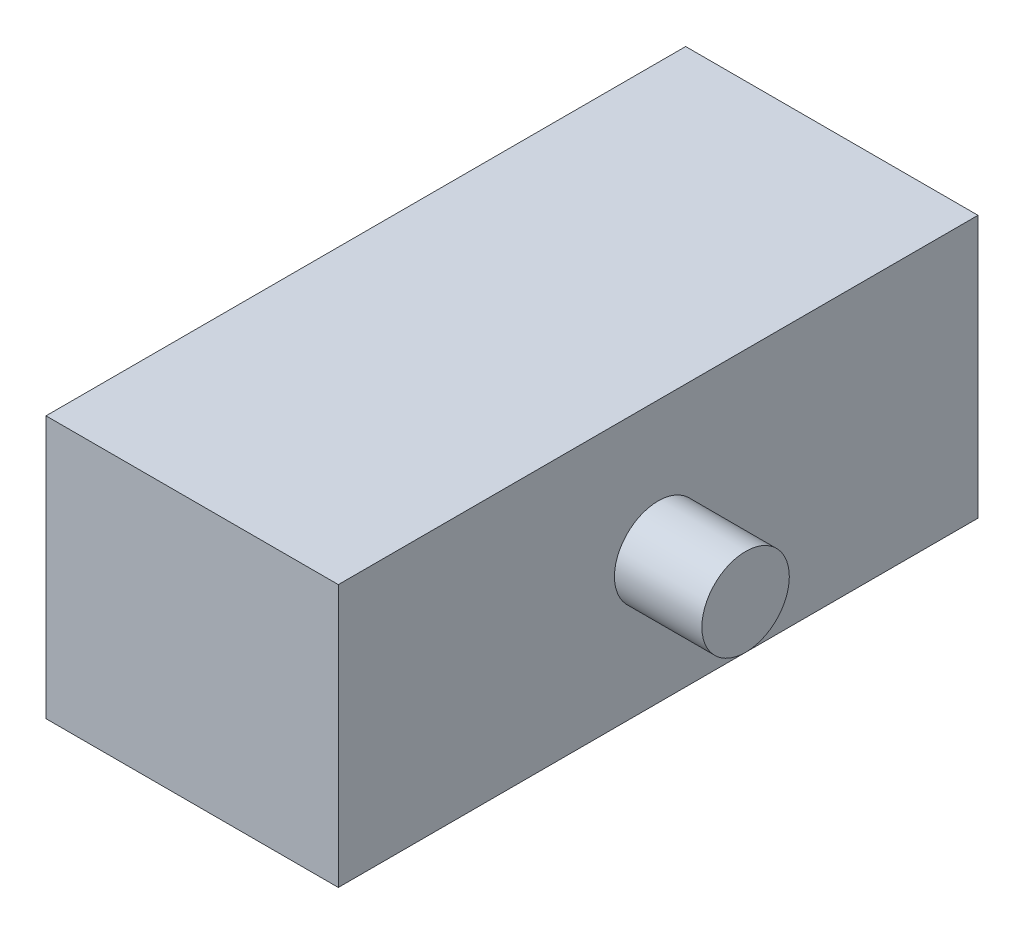
ISO-10303-21;
HEADER;
FILE_DESCRIPTION(('STEP AP214'),'2;1');
FILE_NAME('part.step','',(''),(''),'','','');
FILE_SCHEMA(('AUTOMOTIVE_DESIGN { 1 0 10303 214 1 1 1 1 }'));
ENDSEC;
DATA;
#1=APPLICATION_CONTEXT('core data for automotive mechanical design processes');
#2=APPLICATION_PROTOCOL_DEFINITION('international standard','automotive_design',2000,#1);
#3=PRODUCT_CONTEXT('',#1,'mechanical');
#4=PRODUCT('Part','Part','',(#3));
#5=PRODUCT_RELATED_PRODUCT_CATEGORY('part','',(#4));
#6=PRODUCT_DEFINITION_FORMATION('','',#4);
#7=PRODUCT_DEFINITION_CONTEXT('part definition',#1,'design');
#8=PRODUCT_DEFINITION('design','',#6,#7);
#9=PRODUCT_DEFINITION_SHAPE('','',#8);
#10=(LENGTH_UNIT() NAMED_UNIT(*) SI_UNIT(.MILLI.,.METRE.));
#11=(NAMED_UNIT(*) PLANE_ANGLE_UNIT() SI_UNIT($,.RADIAN.));
#12=(NAMED_UNIT(*) SI_UNIT($,.STERADIAN.) SOLID_ANGLE_UNIT());
#13=UNCERTAINTY_MEASURE_WITH_UNIT(LENGTH_MEASURE(1.E-05),#10,'distance_accuracy_value','');
#14=(GEOMETRIC_REPRESENTATION_CONTEXT(3) GLOBAL_UNCERTAINTY_ASSIGNED_CONTEXT((#13)) GLOBAL_UNIT_ASSIGNED_CONTEXT((#10,
#11,#12)) REPRESENTATION_CONTEXT('',''));
#15=CARTESIAN_POINT('',(0.,0.,0.));
#16=DIRECTION('',(0.,0.,1.));
#17=DIRECTION('',(1.,0.,0.));
#18=AXIS2_PLACEMENT_3D('',#15,#16,#17);
#19=CARTESIAN_POINT('',(8.35841455400516,15.,-18.2892342384718));
#20=DIRECTION('',(-1.,0.,0.));
#21=DIRECTION('',(0.,0.,1.));
#22=AXIS2_PLACEMENT_3D('',#19,#20,#21);
#23=PLANE('',#22);
#24=CARTESIAN_POINT('',(8.35841455400516,7.5,0.));
#25=DIRECTION('',(-1.,0.,0.));
#26=DIRECTION('',(0.,0.,1.));
#27=AXIS2_PLACEMENT_3D('',#24,#25,#26);
#28=CIRCLE('',#27,2.5);
#29=CARTESIAN_POINT('',(8.35841455400516,7.5,2.5));
#30=VERTEX_POINT('',#29);
#31=EDGE_CURVE('E11',#30,#30,#28,.F.);
#32=ORIENTED_EDGE('',*,*,#31,.F.);
#33=EDGE_LOOP('',(#32));
#34=FACE_BOUND('',#33,.T.);
#35=DIRECTION('',(0.,0.,-1.));
#36=VECTOR('',#35,1.);
#37=CARTESIAN_POINT('',(8.35841455400516,0.,-18.2892342384718));
#38=LINE('',#37,#36);
#39=CARTESIAN_POINT('',(8.35841455400516,0.,18.2892342384718));
#40=VERTEX_POINT('',#39);
#41=CARTESIAN_POINT('',(8.35841455400516,0.,-18.2892342384718));
#42=VERTEX_POINT('',#41);
#43=EDGE_CURVE('E103',#40,#42,#38,.T.);
#44=ORIENTED_EDGE('',*,*,#43,.T.);
#45=DIRECTION('',(0.,-1.,0.));
#46=VECTOR('',#45,1.);
#47=CARTESIAN_POINT('',(8.35841455400516,15.,-18.2892342384718));
#48=LINE('',#47,#46);
#49=CARTESIAN_POINT('',(8.35841455400516,15.,-18.2892342384718));
#50=VERTEX_POINT('',#49);
#51=EDGE_CURVE('E45',#50,#42,#48,.T.);
#52=ORIENTED_EDGE('',*,*,#51,.F.);
#53=DIRECTION('',(0.,0.,-1.));
#54=VECTOR('',#53,1.);
#55=CARTESIAN_POINT('',(8.35841455400516,15.,-18.2892342384718));
#56=LINE('',#55,#54);
#57=CARTESIAN_POINT('',(8.35841455400516,15.,18.2892342384718));
#58=VERTEX_POINT('',#57);
#59=EDGE_CURVE('E89',#58,#50,#56,.T.);
#60=ORIENTED_EDGE('',*,*,#59,.F.);
#61=DIRECTION('',(0.,-1.,0.));
#62=VECTOR('',#61,1.);
#63=CARTESIAN_POINT('',(8.35841455400516,15.,18.2892342384718));
#64=LINE('',#63,#62);
#65=EDGE_CURVE('E99',#58,#40,#64,.T.);
#66=ORIENTED_EDGE('',*,*,#65,.T.);
#67=EDGE_LOOP('',(#44,#52,#60,#66));
#68=FACE_BOUND('',#67,.T.);
#69=ADVANCED_FACE('F37',(#34,#68),#23,.F.);
#70=CARTESIAN_POINT('',(-8.35841455400516,15.,-18.2892342384718));
#71=DIRECTION('',(0.,0.,1.));
#72=DIRECTION('',(1.,0.,0.));
#73=AXIS2_PLACEMENT_3D('',#70,#71,#72);
#74=PLANE('',#73);
#75=DIRECTION('',(-1.,0.,0.));
#76=VECTOR('',#75,1.);
#77=CARTESIAN_POINT('',(-8.35841455400516,0.,-18.2892342384718));
#78=LINE('',#77,#76);
#79=CARTESIAN_POINT('',(-8.35841455400516,0.,-18.2892342384718));
#80=VERTEX_POINT('',#79);
#81=EDGE_CURVE('E94',#42,#80,#78,.T.);
#82=ORIENTED_EDGE('',*,*,#81,.T.);
#83=DIRECTION('',(0.,-1.,0.));
#84=VECTOR('',#83,1.);
#85=CARTESIAN_POINT('',(-8.35841455400516,15.,-18.2892342384718));
#86=LINE('',#85,#84);
#87=CARTESIAN_POINT('',(-8.35841455400516,15.,-18.2892342384718));
#88=VERTEX_POINT('',#87);
#89=EDGE_CURVE('E92',#88,#80,#86,.T.);
#90=ORIENTED_EDGE('',*,*,#89,.F.);
#91=DIRECTION('',(-1.,0.,0.));
#92=VECTOR('',#91,1.);
#93=CARTESIAN_POINT('',(-8.35841455400516,15.,-18.2892342384718));
#94=LINE('',#93,#92);
#95=EDGE_CURVE('E84',#50,#88,#94,.T.);
#96=ORIENTED_EDGE('',*,*,#95,.F.);
#97=ORIENTED_EDGE('',*,*,#51,.T.);
#98=EDGE_LOOP('',(#82,#90,#96,#97));
#99=FACE_BOUND('',#98,.T.);
#100=ADVANCED_FACE('F93',(#99),#74,.F.);
#101=CARTESIAN_POINT('',(-8.35841455400516,15.,-18.2892342384718));
#102=DIRECTION('',(1.,0.,0.));
#103=DIRECTION('',(0.,0.,-1.));
#104=AXIS2_PLACEMENT_3D('',#101,#102,#103);
#105=PLANE('',#104);
#106=DIRECTION('',(0.,0.,1.));
#107=VECTOR('',#106,1.);
#108=CARTESIAN_POINT('',(-8.35841455400516,0.,-18.2892342384718));
#109=LINE('',#108,#107);
#110=CARTESIAN_POINT('',(-8.35841455400516,0.,18.2892342384718));
#111=VERTEX_POINT('',#110);
#112=EDGE_CURVE('E70',#80,#111,#109,.T.);
#113=ORIENTED_EDGE('',*,*,#112,.T.);
#114=DIRECTION('',(0.,-1.,0.));
#115=VECTOR('',#114,1.);
#116=CARTESIAN_POINT('',(-8.35841455400516,15.,18.2892342384718));
#117=LINE('',#116,#115);
#118=CARTESIAN_POINT('',(-8.35841455400516,15.,18.2892342384718));
#119=VERTEX_POINT('',#118);
#120=EDGE_CURVE('E95',#119,#111,#117,.T.);
#121=ORIENTED_EDGE('',*,*,#120,.F.);
#122=DIRECTION('',(0.,0.,1.));
#123=VECTOR('',#122,1.);
#124=CARTESIAN_POINT('',(-8.35841455400516,15.,-18.2892342384718));
#125=LINE('',#124,#123);
#126=EDGE_CURVE('E87',#88,#119,#125,.T.);
#127=ORIENTED_EDGE('',*,*,#126,.F.);
#128=ORIENTED_EDGE('',*,*,#89,.T.);
#129=EDGE_LOOP('',(#113,#121,#127,#128));
#130=FACE_BOUND('',#129,.T.);
#131=ADVANCED_FACE('F97',(#130),#105,.F.);
#132=CARTESIAN_POINT('',(-8.35841455400516,15.,18.2892342384718));
#133=DIRECTION('',(0.,0.,-1.));
#134=DIRECTION('',(-1.,0.,0.));
#135=AXIS2_PLACEMENT_3D('',#132,#133,#134);
#136=PLANE('',#135);
#137=DIRECTION('',(1.,0.,0.));
#138=VECTOR('',#137,1.);
#139=CARTESIAN_POINT('',(-8.35841455400516,0.,18.2892342384718));
#140=LINE('',#139,#138);
#141=EDGE_CURVE('E76',#111,#40,#140,.T.);
#142=ORIENTED_EDGE('',*,*,#141,.T.);
#143=ORIENTED_EDGE('',*,*,#65,.F.);
#144=DIRECTION('',(1.,0.,0.));
#145=VECTOR('',#144,1.);
#146=CARTESIAN_POINT('',(-8.35841455400516,15.,18.2892342384718));
#147=LINE('',#146,#145);
#148=EDGE_CURVE('E53',#119,#58,#147,.T.);
#149=ORIENTED_EDGE('',*,*,#148,.F.);
#150=ORIENTED_EDGE('',*,*,#120,.T.);
#151=EDGE_LOOP('',(#142,#143,#149,#150));
#152=FACE_BOUND('',#151,.T.);
#153=ADVANCED_FACE('F125',(#152),#136,.F.);
#154=CARTESIAN_POINT('',(0.,15.,0.));
#155=DIRECTION('',(0.,1.,0.));
#156=DIRECTION('',(0.,0.,1.));
#157=AXIS2_PLACEMENT_3D('',#154,#155,#156);
#158=PLANE('',#157);
#159=ORIENTED_EDGE('',*,*,#59,.T.);
#160=ORIENTED_EDGE('',*,*,#95,.T.);
#161=ORIENTED_EDGE('',*,*,#126,.T.);
#162=ORIENTED_EDGE('',*,*,#148,.T.);
#163=EDGE_LOOP('',(#159,#160,#161,#162));
#164=FACE_BOUND('',#163,.T.);
#165=ADVANCED_FACE('F85',(#164),#158,.T.);
#166=CARTESIAN_POINT('',(0.,0.,0.));
#167=DIRECTION('',(0.,1.,0.));
#168=DIRECTION('',(0.,0.,1.));
#169=AXIS2_PLACEMENT_3D('',#166,#167,#168);
#170=PLANE('',#169);
#171=ORIENTED_EDGE('',*,*,#43,.F.);
#172=ORIENTED_EDGE('',*,*,#141,.F.);
#173=ORIENTED_EDGE('',*,*,#112,.F.);
#174=ORIENTED_EDGE('',*,*,#81,.F.);
#175=EDGE_LOOP('',(#171,#172,#173,#174));
#176=FACE_BOUND('',#175,.T.);
#177=ADVANCED_FACE('F114',(#176),#170,.F.);
#178=CARTESIAN_POINT('',(13.3584145540052,7.5,0.));
#179=DIRECTION('',(-1.,0.,0.));
#180=DIRECTION('',(0.,0.,1.));
#181=AXIS2_PLACEMENT_3D('',#178,#179,#180);
#182=CYLINDRICAL_SURFACE('',#181,2.5);
#183=CARTESIAN_POINT('',(13.3584145540052,7.5,0.));
#184=DIRECTION('',(1.,0.,0.));
#185=DIRECTION('',(0.,0.,-1.));
#186=AXIS2_PLACEMENT_3D('',#183,#184,#185);
#187=CIRCLE('',#186,2.5);
#188=CARTESIAN_POINT('',(13.3584145540052,7.5,-2.5));
#189=VERTEX_POINT('',#188);
#190=EDGE_CURVE('E106',#189,#189,#187,.T.);
#191=ORIENTED_EDGE('',*,*,#190,.F.);
#192=EDGE_LOOP('',(#191));
#193=FACE_BOUND('',#192,.T.);
#194=ORIENTED_EDGE('',*,*,#31,.T.);
#195=EDGE_LOOP('',(#194));
#196=FACE_BOUND('',#195,.T.);
#197=ADVANCED_FACE('F116',(#193,#196),#182,.T.);
#198=CARTESIAN_POINT('',(13.3584145540052,7.5,0.));
#199=DIRECTION('',(1.,0.,0.));
#200=DIRECTION('',(0.,0.,-1.));
#201=AXIS2_PLACEMENT_3D('',#198,#199,#200);
#202=PLANE('',#201);
#203=ORIENTED_EDGE('',*,*,#190,.T.);
#204=EDGE_LOOP('',(#203));
#205=FACE_BOUND('',#204,.T.);
#206=ADVANCED_FACE('F122',(#205),#202,.T.);
#207=CLOSED_SHELL('',(#69,#100,#131,#153,#165,#177,#197,#206));
#208=MANIFOLD_SOLID_BREP('B2',#207);
#209=ADVANCED_BREP_SHAPE_REPRESENTATION('',(#18,#208),#14);
#210=SHAPE_DEFINITION_REPRESENTATION(#9,#209);
ENDSEC;
END-ISO-10303-21;
